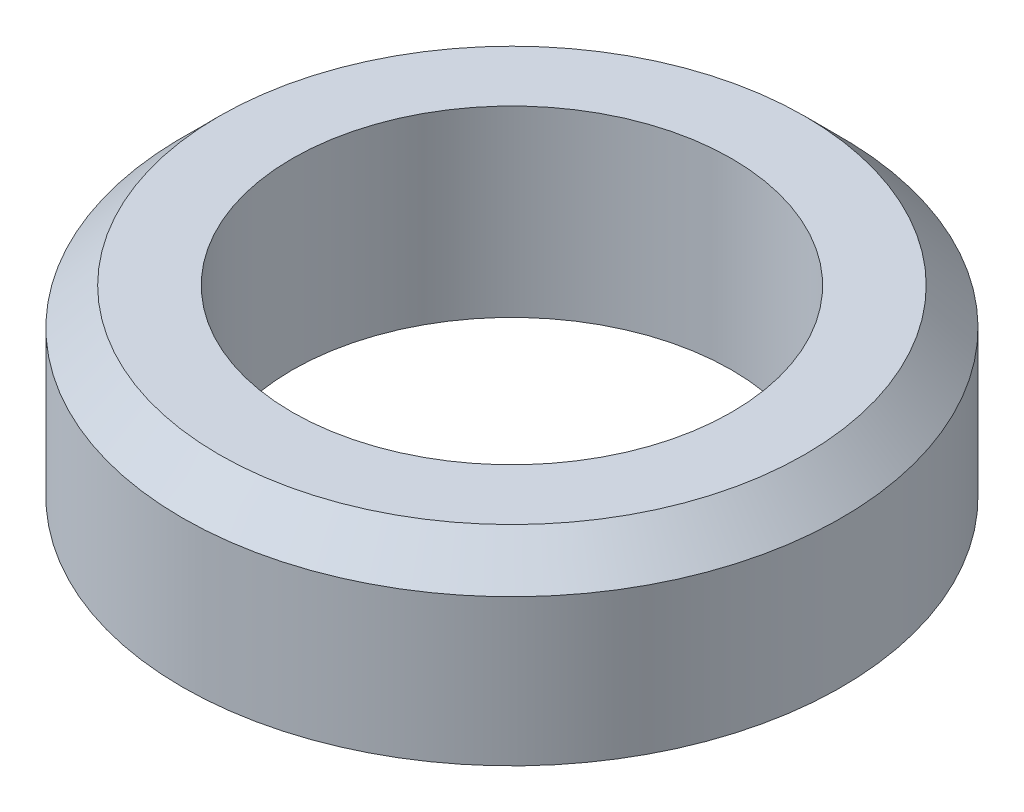
ISO-10303-21;
HEADER;
FILE_DESCRIPTION(('STEP AP214'),'2;1');
FILE_NAME('part.step','',(''),(''),'','','');
FILE_SCHEMA(('AUTOMOTIVE_DESIGN { 1 0 10303 214 1 1 1 1 }'));
ENDSEC;
DATA;
#1=APPLICATION_CONTEXT('core data for automotive mechanical design processes');
#2=APPLICATION_PROTOCOL_DEFINITION('international standard','automotive_design',2000,#1);
#3=PRODUCT_CONTEXT('',#1,'mechanical');
#4=PRODUCT('Part','Part','',(#3));
#5=PRODUCT_RELATED_PRODUCT_CATEGORY('part','',(#4));
#6=PRODUCT_DEFINITION_FORMATION('','',#4);
#7=PRODUCT_DEFINITION_CONTEXT('part definition',#1,'design');
#8=PRODUCT_DEFINITION('design','',#6,#7);
#9=PRODUCT_DEFINITION_SHAPE('','',#8);
#10=(LENGTH_UNIT() NAMED_UNIT(*) SI_UNIT(.MILLI.,.METRE.));
#11=(NAMED_UNIT(*) PLANE_ANGLE_UNIT() SI_UNIT($,.RADIAN.));
#12=(NAMED_UNIT(*) SI_UNIT($,.STERADIAN.) SOLID_ANGLE_UNIT());
#13=UNCERTAINTY_MEASURE_WITH_UNIT(LENGTH_MEASURE(1.E-05),#10,'distance_accuracy_value','');
#14=(GEOMETRIC_REPRESENTATION_CONTEXT(3) GLOBAL_UNCERTAINTY_ASSIGNED_CONTEXT((#13)) GLOBAL_UNIT_ASSIGNED_CONTEXT((#10,
#11,#12)) REPRESENTATION_CONTEXT('',''));
#15=CARTESIAN_POINT('',(0.,0.,0.));
#16=DIRECTION('',(0.,0.,1.));
#17=DIRECTION('',(1.,0.,0.));
#18=AXIS2_PLACEMENT_3D('',#15,#16,#17);
#19=CARTESIAN_POINT('',(0.,2.5,0.));
#20=DIRECTION('',(0.,1.,0.));
#21=DIRECTION('',(0.,0.,1.));
#22=AXIS2_PLACEMENT_3D('',#19,#20,#21);
#23=PLANE('',#22);
#24=CARTESIAN_POINT('',(0.,2.5,0.));
#25=DIRECTION('',(0.,1.,0.));
#26=DIRECTION('',(0.,0.,1.));
#27=AXIS2_PLACEMENT_3D('',#24,#25,#26);
#28=CIRCLE('',#27,4.);
#29=CARTESIAN_POINT('',(0.,2.5,4.));
#30=VERTEX_POINT('',#29);
#31=EDGE_CURVE('E40',#30,#30,#28,.T.);
#32=ORIENTED_EDGE('',*,*,#31,.T.);
#33=EDGE_LOOP('',(#32));
#34=FACE_BOUND('',#33,.T.);
#35=CARTESIAN_POINT('',(0.,2.5,0.));
#36=DIRECTION('',(0.,1.,0.));
#37=DIRECTION('',(0.,0.,1.));
#38=AXIS2_PLACEMENT_3D('',#35,#36,#37);
#39=CIRCLE('',#38,3.);
#40=CARTESIAN_POINT('',(0.,2.5,3.));
#41=VERTEX_POINT('',#40);
#42=EDGE_CURVE('E48',#41,#41,#39,.T.);
#43=ORIENTED_EDGE('',*,*,#42,.F.);
#44=EDGE_LOOP('',(#43));
#45=FACE_BOUND('',#44,.T.);
#46=ADVANCED_FACE('F33',(#34,#45),#23,.T.);
#47=CARTESIAN_POINT('',(0.,0.,0.));
#48=DIRECTION('',(0.,1.,0.));
#49=DIRECTION('',(0.,0.,1.));
#50=AXIS2_PLACEMENT_3D('',#47,#48,#49);
#51=PLANE('',#50);
#52=CARTESIAN_POINT('',(0.,0.,0.));
#53=DIRECTION('',(0.,1.,0.));
#54=DIRECTION('',(0.,0.,1.));
#55=AXIS2_PLACEMENT_3D('',#52,#53,#54);
#56=CIRCLE('',#55,4.5);
#57=CARTESIAN_POINT('',(0.,0.,4.5));
#58=VERTEX_POINT('',#57);
#59=EDGE_CURVE('E44',#58,#58,#56,.T.);
#60=ORIENTED_EDGE('',*,*,#59,.F.);
#61=EDGE_LOOP('',(#60));
#62=FACE_BOUND('',#61,.T.);
#63=CARTESIAN_POINT('',(0.,0.,0.));
#64=DIRECTION('',(0.,1.,0.));
#65=DIRECTION('',(0.,0.,1.));
#66=AXIS2_PLACEMENT_3D('',#63,#64,#65);
#67=CIRCLE('',#66,3.);
#68=CARTESIAN_POINT('',(0.,0.,3.));
#69=VERTEX_POINT('',#68);
#70=EDGE_CURVE('E51',#69,#69,#67,.T.);
#71=ORIENTED_EDGE('',*,*,#70,.T.);
#72=EDGE_LOOP('',(#71));
#73=FACE_BOUND('',#72,.T.);
#74=ADVANCED_FACE('F61',(#62,#73),#51,.F.);
#75=CARTESIAN_POINT('',(0.,2.5,0.));
#76=DIRECTION('',(0.,-1.,0.));
#77=DIRECTION('',(0.,0.,-1.));
#78=AXIS2_PLACEMENT_3D('',#75,#76,#77);
#79=CYLINDRICAL_SURFACE('',#78,4.5);
#80=CARTESIAN_POINT('',(0.,2.,0.));
#81=DIRECTION('',(0.,1.,0.));
#82=DIRECTION('',(0.,0.,1.));
#83=AXIS2_PLACEMENT_3D('',#80,#81,#82);
#84=CIRCLE('',#83,4.5);
#85=CARTESIAN_POINT('',(0.,2.,4.5));
#86=VERTEX_POINT('',#85);
#87=EDGE_CURVE('E10',#86,#86,#84,.F.);
#88=ORIENTED_EDGE('',*,*,#87,.T.);
#89=EDGE_LOOP('',(#88));
#90=FACE_BOUND('',#89,.T.);
#91=ORIENTED_EDGE('',*,*,#59,.T.);
#92=EDGE_LOOP('',(#91));
#93=FACE_BOUND('',#92,.T.);
#94=ADVANCED_FACE('F66',(#90,#93),#79,.T.);
#95=CARTESIAN_POINT('',(0.,2.5,0.));
#96=DIRECTION('',(0.,-1.,0.));
#97=DIRECTION('',(0.,0.,-1.));
#98=AXIS2_PLACEMENT_3D('',#95,#96,#97);
#99=CYLINDRICAL_SURFACE('',#98,3.);
#100=ORIENTED_EDGE('',*,*,#42,.T.);
#101=EDGE_LOOP('',(#100));
#102=FACE_BOUND('',#101,.T.);
#103=ORIENTED_EDGE('',*,*,#70,.F.);
#104=EDGE_LOOP('',(#103));
#105=FACE_BOUND('',#104,.T.);
#106=ADVANCED_FACE('F57',(#102,#105),#99,.F.);
#107=CARTESIAN_POINT('',(0.,2.5,0.));
#108=DIRECTION('',(0.,-1.,0.));
#109=DIRECTION('',(0.,0.,-1.));
#110=AXIS2_PLACEMENT_3D('',#107,#108,#109);
#111=CONICAL_SURFACE('',#110,4.,0.785398163397447);
#112=ORIENTED_EDGE('',*,*,#87,.F.);
#113=EDGE_LOOP('',(#112));
#114=FACE_BOUND('',#113,.T.);
#115=ORIENTED_EDGE('',*,*,#31,.F.);
#116=EDGE_LOOP('',(#115));
#117=FACE_BOUND('',#116,.T.);
#118=ADVANCED_FACE('F35',(#114,#117),#111,.T.);
#119=CLOSED_SHELL('',(#46,#74,#94,#106,#118));
#120=MANIFOLD_SOLID_BREP('B2',#119);
#121=ADVANCED_BREP_SHAPE_REPRESENTATION('',(#18,#120),#14);
#122=SHAPE_DEFINITION_REPRESENTATION(#9,#121);
ENDSEC;
END-ISO-10303-21;
